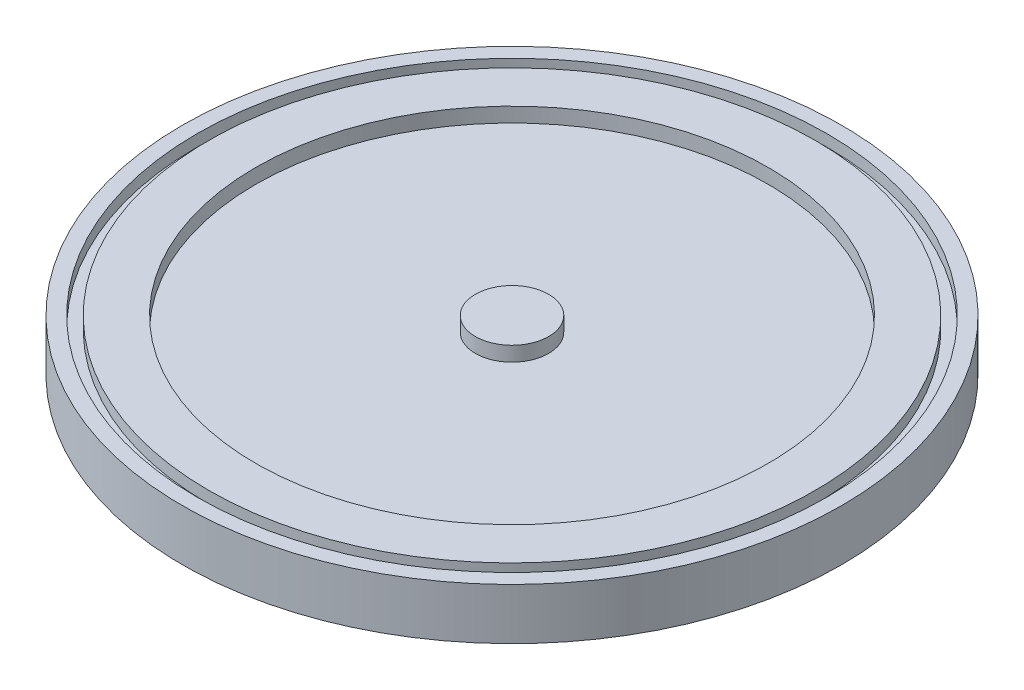
ISO-10303-21;
HEADER;
FILE_DESCRIPTION(('STEP AP214'),'2;1');
FILE_NAME('part.step','',(''),(''),'','','');
FILE_SCHEMA(('AUTOMOTIVE_DESIGN { 1 0 10303 214 1 1 1 1 }'));
ENDSEC;
DATA;
#1=APPLICATION_CONTEXT('core data for automotive mechanical design processes');
#2=APPLICATION_PROTOCOL_DEFINITION('international standard','automotive_design',2000,#1);
#3=PRODUCT_CONTEXT('',#1,'mechanical');
#4=PRODUCT('Part','Part','',(#3));
#5=PRODUCT_RELATED_PRODUCT_CATEGORY('part','',(#4));
#6=PRODUCT_DEFINITION_FORMATION('','',#4);
#7=PRODUCT_DEFINITION_CONTEXT('part definition',#1,'design');
#8=PRODUCT_DEFINITION('design','',#6,#7);
#9=PRODUCT_DEFINITION_SHAPE('','',#8);
#10=(LENGTH_UNIT() NAMED_UNIT(*) SI_UNIT(.MILLI.,.METRE.));
#11=(NAMED_UNIT(*) PLANE_ANGLE_UNIT() SI_UNIT($,.RADIAN.));
#12=(NAMED_UNIT(*) SI_UNIT($,.STERADIAN.) SOLID_ANGLE_UNIT());
#13=UNCERTAINTY_MEASURE_WITH_UNIT(LENGTH_MEASURE(1.E-05),#10,'distance_accuracy_value','');
#14=(GEOMETRIC_REPRESENTATION_CONTEXT(3) GLOBAL_UNCERTAINTY_ASSIGNED_CONTEXT((#13)) GLOBAL_UNIT_ASSIGNED_CONTEXT((#10,
#11,#12)) REPRESENTATION_CONTEXT('',''));
#15=CARTESIAN_POINT('',(0.,0.,0.));
#16=DIRECTION('',(0.,0.,1.));
#17=DIRECTION('',(1.,0.,0.));
#18=AXIS2_PLACEMENT_3D('',#15,#16,#17);
#19=CARTESIAN_POINT('',(57.15,8.89,0.));
#20=DIRECTION('',(0.,-1.,0.));
#21=DIRECTION('',(1.,0.,0.));
#22=AXIS2_PLACEMENT_3D('',#19,#20,#21);
#23=PLANE('',#22);
#24=CARTESIAN_POINT('',(0.,8.89,0.));
#25=DIRECTION('',(0.,1.,0.));
#26=DIRECTION('',(0.,0.,1.));
#27=AXIS2_PLACEMENT_3D('',#24,#25,#26);
#28=CIRCLE('',#27,52.5779999999901);
#29=CARTESIAN_POINT('',(0.,8.89,52.5779999999901));
#30=VERTEX_POINT('',#29);
#31=EDGE_CURVE('E68',#30,#30,#28,.T.);
#32=ORIENTED_EDGE('',*,*,#31,.T.);
#33=EDGE_LOOP('',(#32));
#34=FACE_BOUND('',#33,.T.);
#35=CARTESIAN_POINT('',(0.,8.88999999999999,0.));
#36=DIRECTION('',(0.,1.,0.));
#37=DIRECTION('',(-1.,0.,0.));
#38=AXIS2_PLACEMENT_3D('',#35,#36,#37);
#39=CIRCLE('',#38,44.45);
#40=CARTESIAN_POINT('',(-44.45,8.88999999999999,0.));
#41=VERTEX_POINT('',#40);
#42=EDGE_CURVE('E49',#41,#41,#39,.T.);
#43=ORIENTED_EDGE('',*,*,#42,.F.);
#44=EDGE_LOOP('',(#43));
#45=FACE_BOUND('',#44,.T.);
#46=ADVANCED_FACE('F38',(#34,#45),#23,.F.);
#47=CARTESIAN_POINT('',(0.,0.,0.));
#48=DIRECTION('',(0.,1.,0.));
#49=DIRECTION('',(-1.,0.,0.));
#50=AXIS2_PLACEMENT_3D('',#47,#48,#49);
#51=CYLINDRICAL_SURFACE('',#50,44.45);
#52=CARTESIAN_POINT('',(0.,6.34999999999999,0.));
#53=DIRECTION('',(0.,1.,0.));
#54=DIRECTION('',(-1.,0.,0.));
#55=AXIS2_PLACEMENT_3D('',#52,#53,#54);
#56=CIRCLE('',#55,44.45);
#57=CARTESIAN_POINT('',(-44.45,6.34999999999999,0.));
#58=VERTEX_POINT('',#57);
#59=EDGE_CURVE('E53',#58,#58,#56,.T.);
#60=ORIENTED_EDGE('',*,*,#59,.F.);
#61=EDGE_LOOP('',(#60));
#62=FACE_BOUND('',#61,.T.);
#63=ORIENTED_EDGE('',*,*,#42,.T.);
#64=EDGE_LOOP('',(#63));
#65=FACE_BOUND('',#64,.T.);
#66=ADVANCED_FACE('F109',(#62,#65),#51,.F.);
#67=CARTESIAN_POINT('',(44.45,6.35,0.));
#68=DIRECTION('',(0.,-1.,0.));
#69=DIRECTION('',(1.,0.,0.));
#70=AXIS2_PLACEMENT_3D('',#67,#68,#69);
#71=PLANE('',#70);
#72=CARTESIAN_POINT('',(0.,6.34999999999999,0.));
#73=DIRECTION('',(0.,1.,0.));
#74=DIRECTION('',(-1.,0.,0.));
#75=AXIS2_PLACEMENT_3D('',#72,#73,#74);
#76=CIRCLE('',#75,6.35);
#77=CARTESIAN_POINT('',(-6.35,6.34999999999999,0.));
#78=VERTEX_POINT('',#77);
#79=EDGE_CURVE('E58',#78,#78,#76,.T.);
#80=ORIENTED_EDGE('',*,*,#79,.F.);
#81=EDGE_LOOP('',(#80));
#82=FACE_BOUND('',#81,.T.);
#83=ORIENTED_EDGE('',*,*,#59,.T.);
#84=EDGE_LOOP('',(#83));
#85=FACE_BOUND('',#84,.T.);
#86=ADVANCED_FACE('F115',(#82,#85),#71,.F.);
#87=CARTESIAN_POINT('',(0.,0.,0.));
#88=DIRECTION('',(0.,1.,0.));
#89=DIRECTION('',(-1.,0.,0.));
#90=AXIS2_PLACEMENT_3D('',#87,#88,#89);
#91=CYLINDRICAL_SURFACE('',#90,6.35);
#92=CARTESIAN_POINT('',(0.,8.89,0.));
#93=DIRECTION('',(0.,1.,0.));
#94=DIRECTION('',(-1.,0.,0.));
#95=AXIS2_PLACEMENT_3D('',#92,#93,#94);
#96=CIRCLE('',#95,6.35);
#97=CARTESIAN_POINT('',(-6.35,8.89,0.));
#98=VERTEX_POINT('',#97);
#99=EDGE_CURVE('E61',#98,#98,#96,.T.);
#100=ORIENTED_EDGE('',*,*,#99,.F.);
#101=EDGE_LOOP('',(#100));
#102=FACE_BOUND('',#101,.T.);
#103=ORIENTED_EDGE('',*,*,#79,.T.);
#104=EDGE_LOOP('',(#103));
#105=FACE_BOUND('',#104,.T.);
#106=ADVANCED_FACE('F104',(#102,#105),#91,.T.);
#107=CARTESIAN_POINT('',(0.,8.89,0.));
#108=DIRECTION('',(0.,-1.,0.));
#109=DIRECTION('',(1.,0.,0.));
#110=AXIS2_PLACEMENT_3D('',#107,#108,#109);
#111=PLANE('',#110);
#112=ORIENTED_EDGE('',*,*,#99,.T.);
#113=EDGE_LOOP('',(#112));
#114=FACE_BOUND('',#113,.T.);
#115=ADVANCED_FACE('F94',(#114),#111,.F.);
#116=CARTESIAN_POINT('',(0.,0.,0.));
#117=DIRECTION('',(0.,1.,0.));
#118=DIRECTION('',(0.,0.,1.));
#119=AXIS2_PLACEMENT_3D('',#116,#117,#118);
#120=CYLINDRICAL_SURFACE('',#119,52.5779999999901);
#121=CARTESIAN_POINT('',(0.,6.858,0.));
#122=DIRECTION('',(0.,1.,0.));
#123=DIRECTION('',(0.,0.,1.));
#124=AXIS2_PLACEMENT_3D('',#121,#122,#123);
#125=CIRCLE('',#124,52.5779999999901);
#126=CARTESIAN_POINT('',(0.,6.858,52.5779999999901));
#127=VERTEX_POINT('',#126);
#128=EDGE_CURVE('E64',#127,#127,#125,.T.);
#129=ORIENTED_EDGE('',*,*,#128,.T.);
#130=EDGE_LOOP('',(#129));
#131=FACE_BOUND('',#130,.T.);
#132=ORIENTED_EDGE('',*,*,#31,.F.);
#133=EDGE_LOOP('',(#132));
#134=FACE_BOUND('',#133,.T.);
#135=ADVANCED_FACE('F91',(#131,#134),#120,.T.);
#136=CARTESIAN_POINT('',(52.5779999999901,6.858,0.));
#137=DIRECTION('',(0.,1.,0.));
#138=DIRECTION('',(0.,0.,1.));
#139=AXIS2_PLACEMENT_3D('',#136,#137,#138);
#140=PLANE('',#139);
#141=CARTESIAN_POINT('',(0.,6.858,0.));
#142=DIRECTION('',(0.,1.,0.));
#143=DIRECTION('',(0.,0.,1.));
#144=AXIS2_PLACEMENT_3D('',#141,#142,#143);
#145=CIRCLE('',#144,54.6099999999901);
#146=CARTESIAN_POINT('',(0.,6.858,54.6099999999901));
#147=VERTEX_POINT('',#146);
#148=EDGE_CURVE('E80',#147,#147,#145,.T.);
#149=ORIENTED_EDGE('',*,*,#148,.T.);
#150=EDGE_LOOP('',(#149));
#151=FACE_BOUND('',#150,.T.);
#152=ORIENTED_EDGE('',*,*,#128,.F.);
#153=EDGE_LOOP('',(#152));
#154=FACE_BOUND('',#153,.T.);
#155=ADVANCED_FACE('F93',(#151,#154),#140,.T.);
#156=CARTESIAN_POINT('',(0.,0.,0.));
#157=DIRECTION('',(0.,1.,0.));
#158=DIRECTION('',(0.,0.,1.));
#159=AXIS2_PLACEMENT_3D('',#156,#157,#158);
#160=CYLINDRICAL_SURFACE('',#159,54.6099999999901);
#161=CARTESIAN_POINT('',(0.,8.89,0.));
#162=DIRECTION('',(0.,1.,0.));
#163=DIRECTION('',(0.,0.,1.));
#164=AXIS2_PLACEMENT_3D('',#161,#162,#163);
#165=CIRCLE('',#164,54.6099999999901);
#166=CARTESIAN_POINT('',(0.,8.89,54.6099999999901));
#167=VERTEX_POINT('',#166);
#168=EDGE_CURVE('E83',#167,#167,#165,.T.);
#169=ORIENTED_EDGE('',*,*,#168,.T.);
#170=EDGE_LOOP('',(#169));
#171=FACE_BOUND('',#170,.T.);
#172=ORIENTED_EDGE('',*,*,#148,.F.);
#173=EDGE_LOOP('',(#172));
#174=FACE_BOUND('',#173,.T.);
#175=ADVANCED_FACE('F101',(#171,#174),#160,.F.);
#176=CARTESIAN_POINT('',(0.,0.,0.));
#177=DIRECTION('',(0.,1.,0.));
#178=DIRECTION('',(-1.,0.,0.));
#179=AXIS2_PLACEMENT_3D('',#176,#177,#178);
#180=PLANE('',#179);
#181=CARTESIAN_POINT('',(0.,0.,0.));
#182=DIRECTION('',(0.,1.,0.));
#183=DIRECTION('',(0.,0.,1.));
#184=AXIS2_PLACEMENT_3D('',#181,#182,#183);
#185=CIRCLE('',#184,54.6099999999901);
#186=CARTESIAN_POINT('',(0.,0.,54.6099999999901));
#187=VERTEX_POINT('',#186);
#188=EDGE_CURVE('E72',#187,#187,#185,.T.);
#189=ORIENTED_EDGE('',*,*,#188,.T.);
#190=EDGE_LOOP('',(#189));
#191=FACE_BOUND('',#190,.T.);
#192=CARTESIAN_POINT('',(0.,0.,0.));
#193=DIRECTION('',(0.,1.,0.));
#194=DIRECTION('',(-1.,0.,0.));
#195=AXIS2_PLACEMENT_3D('',#192,#193,#194);
#196=CIRCLE('',#195,57.1499999999801);
#197=CARTESIAN_POINT('',(-57.1499999999801,0.,0.));
#198=VERTEX_POINT('',#197);
#199=EDGE_CURVE('E10',#198,#198,#196,.T.);
#200=ORIENTED_EDGE('',*,*,#199,.F.);
#201=EDGE_LOOP('',(#200));
#202=FACE_BOUND('',#201,.T.);
#203=ADVANCED_FACE('F40',(#191,#202),#180,.F.);
#204=CARTESIAN_POINT('',(0.,0.,0.));
#205=DIRECTION('',(0.,1.,0.));
#206=DIRECTION('',(-1.,0.,0.));
#207=AXIS2_PLACEMENT_3D('',#204,#205,#206);
#208=CYLINDRICAL_SURFACE('',#207,57.1499999999901);
#209=CARTESIAN_POINT('',(0.,8.89,0.));
#210=DIRECTION('',(0.,1.,0.));
#211=DIRECTION('',(-1.,0.,0.));
#212=AXIS2_PLACEMENT_3D('',#209,#210,#211);
#213=CIRCLE('',#212,57.15);
#214=CARTESIAN_POINT('',(-57.15,8.88999999999999,0.));
#215=VERTEX_POINT('',#214);
#216=EDGE_CURVE('E45',#215,#215,#213,.T.);
#217=ORIENTED_EDGE('',*,*,#216,.F.);
#218=EDGE_LOOP('',(#217));
#219=FACE_BOUND('',#218,.T.);
#220=ORIENTED_EDGE('',*,*,#199,.T.);
#221=EDGE_LOOP('',(#220));
#222=FACE_BOUND('',#221,.T.);
#223=ADVANCED_FACE('F120',(#219,#222),#208,.T.);
#224=ORIENTED_EDGE('',*,*,#168,.F.);
#225=EDGE_LOOP('',(#224));
#226=FACE_BOUND('',#225,.T.);
#227=ORIENTED_EDGE('',*,*,#216,.T.);
#228=EDGE_LOOP('',(#227));
#229=FACE_BOUND('',#228,.T.);
#230=ADVANCED_FACE('F111',(#226,#229),#23,.F.);
#231=CARTESIAN_POINT('',(0.,0.,0.));
#232=DIRECTION('',(0.,1.,0.));
#233=DIRECTION('',(0.,0.,1.));
#234=AXIS2_PLACEMENT_3D('',#231,#232,#233);
#235=CYLINDRICAL_SURFACE('',#234,52.5779999999901);
#236=CARTESIAN_POINT('',(0.,0.,0.));
#237=DIRECTION('',(0.,1.,0.));
#238=DIRECTION('',(0.,0.,1.));
#239=AXIS2_PLACEMENT_3D('',#236,#237,#238);
#240=CIRCLE('',#239,52.5779999999901);
#241=CARTESIAN_POINT('',(0.,0.,52.5779999999901));
#242=VERTEX_POINT('',#241);
#243=EDGE_CURVE('E75',#242,#242,#240,.T.);
#244=ORIENTED_EDGE('',*,*,#243,.T.);
#245=EDGE_LOOP('',(#244));
#246=FACE_BOUND('',#245,.T.);
#247=CARTESIAN_POINT('',(0.,2.03199999999999,0.));
#248=DIRECTION('',(0.,1.,0.));
#249=DIRECTION('',(0.,0.,1.));
#250=AXIS2_PLACEMENT_3D('',#247,#248,#249);
#251=CIRCLE('',#250,52.5779999999901);
#252=CARTESIAN_POINT('',(0.,2.03199999999999,52.5779999999901));
#253=VERTEX_POINT('',#252);
#254=EDGE_CURVE('E65',#253,#253,#251,.T.);
#255=ORIENTED_EDGE('',*,*,#254,.F.);
#256=EDGE_LOOP('',(#255));
#257=FACE_BOUND('',#256,.T.);
#258=ADVANCED_FACE('F119',(#246,#257),#235,.T.);
#259=CARTESIAN_POINT('',(52.5779999999901,2.03199999999999,0.));
#260=DIRECTION('',(0.,-1.,0.));
#261=DIRECTION('',(0.,0.,-1.));
#262=AXIS2_PLACEMENT_3D('',#259,#260,#261);
#263=PLANE('',#262);
#264=ORIENTED_EDGE('',*,*,#254,.T.);
#265=EDGE_LOOP('',(#264));
#266=FACE_BOUND('',#265,.T.);
#267=CARTESIAN_POINT('',(0.,2.03199999999999,0.));
#268=DIRECTION('',(0.,1.,0.));
#269=DIRECTION('',(0.,0.,1.));
#270=AXIS2_PLACEMENT_3D('',#267,#268,#269);
#271=CIRCLE('',#270,54.6099999999901);
#272=CARTESIAN_POINT('',(0.,2.03199999999999,54.6099999999901));
#273=VERTEX_POINT('',#272);
#274=EDGE_CURVE('E69',#273,#273,#271,.T.);
#275=ORIENTED_EDGE('',*,*,#274,.F.);
#276=EDGE_LOOP('',(#275));
#277=FACE_BOUND('',#276,.T.);
#278=ADVANCED_FACE('F126',(#266,#277),#263,.T.);
#279=CARTESIAN_POINT('',(0.,0.,0.));
#280=DIRECTION('',(0.,1.,0.));
#281=DIRECTION('',(0.,0.,1.));
#282=AXIS2_PLACEMENT_3D('',#279,#280,#281);
#283=CYLINDRICAL_SURFACE('',#282,54.6099999999901);
#284=ORIENTED_EDGE('',*,*,#274,.T.);
#285=EDGE_LOOP('',(#284));
#286=FACE_BOUND('',#285,.T.);
#287=ORIENTED_EDGE('',*,*,#188,.F.);
#288=EDGE_LOOP('',(#287));
#289=FACE_BOUND('',#288,.T.);
#290=ADVANCED_FACE('F147',(#286,#289),#283,.F.);
#291=ORIENTED_EDGE('',*,*,#243,.F.);
#292=EDGE_LOOP('',(#291));
#293=FACE_BOUND('',#292,.T.);
#294=ADVANCED_FACE('F142',(#293),#180,.F.);
#295=CLOSED_SHELL('',(#46,#66,#86,#106,#115,#135,#155,#175,#203,#223,#230,#258,#278,#290,#294));
#296=MANIFOLD_SOLID_BREP('B2',#295);
#297=ADVANCED_BREP_SHAPE_REPRESENTATION('',(#18,#296),#14);
#298=SHAPE_DEFINITION_REPRESENTATION(#9,#297);
ENDSEC;
END-ISO-10303-21;
